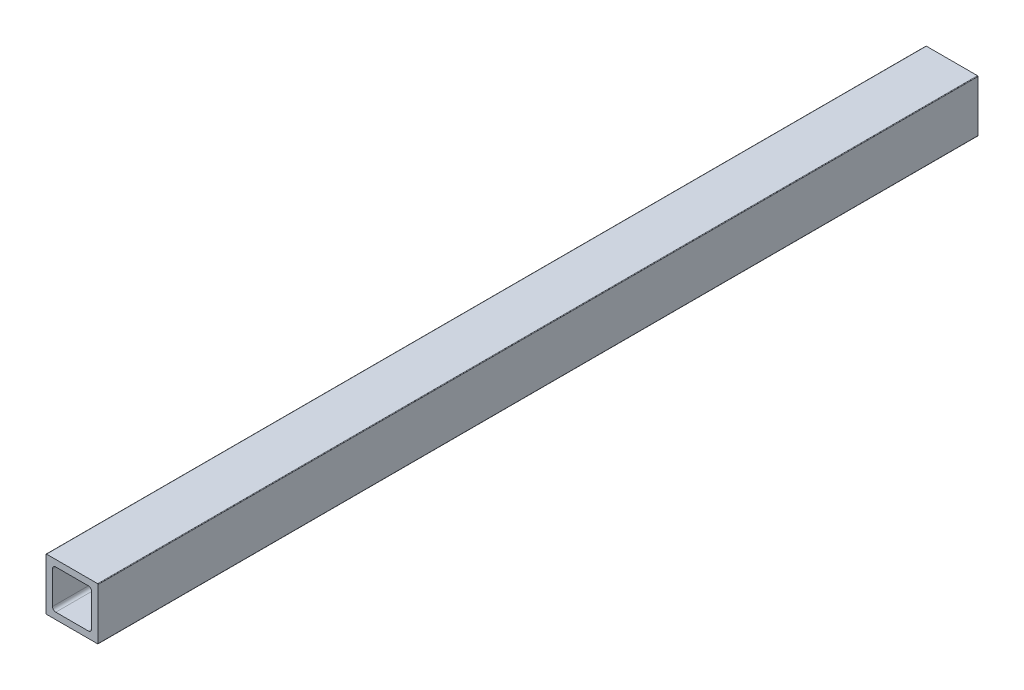
ISO-10303-21;
HEADER;
FILE_DESCRIPTION(('STEP AP214'),'2;1');
FILE_NAME('part.step','',(''),(''),'','','');
FILE_SCHEMA(('AUTOMOTIVE_DESIGN { 1 0 10303 214 1 1 1 1 }'));
ENDSEC;
DATA;
#1=APPLICATION_CONTEXT('core data for automotive mechanical design processes');
#2=APPLICATION_PROTOCOL_DEFINITION('international standard','automotive_design',2000,#1);
#3=PRODUCT_CONTEXT('',#1,'mechanical');
#4=PRODUCT('Part','Part','',(#3));
#5=PRODUCT_RELATED_PRODUCT_CATEGORY('part','',(#4));
#6=PRODUCT_DEFINITION_FORMATION('','',#4);
#7=PRODUCT_DEFINITION_CONTEXT('part definition',#1,'design');
#8=PRODUCT_DEFINITION('design','',#6,#7);
#9=PRODUCT_DEFINITION_SHAPE('','',#8);
#10=(LENGTH_UNIT() NAMED_UNIT(*) SI_UNIT(.MILLI.,.METRE.));
#11=(NAMED_UNIT(*) PLANE_ANGLE_UNIT() SI_UNIT($,.RADIAN.));
#12=(NAMED_UNIT(*) SI_UNIT($,.STERADIAN.) SOLID_ANGLE_UNIT());
#13=UNCERTAINTY_MEASURE_WITH_UNIT(LENGTH_MEASURE(1.E-05),#10,'distance_accuracy_value','');
#14=(GEOMETRIC_REPRESENTATION_CONTEXT(3) GLOBAL_UNCERTAINTY_ASSIGNED_CONTEXT((#13)) GLOBAL_UNIT_ASSIGNED_CONTEXT((#10,
#11,#12)) REPRESENTATION_CONTEXT('',''));
#15=CARTESIAN_POINT('',(0.,0.,0.));
#16=DIRECTION('',(0.,0.,1.));
#17=DIRECTION('',(1.,0.,0.));
#18=AXIS2_PLACEMENT_3D('',#15,#16,#17);
#19=CARTESIAN_POINT('',(0.254,0.254,0.));
#20=DIRECTION('',(0.,0.,-1.));
#21=DIRECTION('',(0.,-1.,0.));
#22=AXIS2_PLACEMENT_3D('',#19,#20,#21);
#23=PLANE('',#22);
#24=CARTESIAN_POINT('',(0.254,0.254,0.));
#25=DIRECTION('',(0.,0.,1.));
#26=DIRECTION('',(-1.,0.,0.));
#27=AXIS2_PLACEMENT_3D('',#24,#25,#26);
#28=CIRCLE('',#27,0.254);
#29=CARTESIAN_POINT('',(0.,0.254,0.));
#30=VERTEX_POINT('',#29);
#31=CARTESIAN_POINT('',(0.254,0.,0.));
#32=VERTEX_POINT('',#31);
#33=EDGE_CURVE('E193',#30,#32,#28,.T.);
#34=ORIENTED_EDGE('',*,*,#33,.F.);
#35=DIRECTION('',(0.,-1.,0.));
#36=VECTOR('',#35,1.);
#37=CARTESIAN_POINT('',(0.,0.254,0.));
#38=LINE('',#37,#36);
#39=CARTESIAN_POINT('',(0.,25.146,0.));
#40=VERTEX_POINT('',#39);
#41=EDGE_CURVE('E191',#40,#30,#38,.T.);
#42=ORIENTED_EDGE('',*,*,#41,.F.);
#43=CARTESIAN_POINT('',(0.254,25.146,0.));
#44=DIRECTION('',(0.,0.,1.));
#45=DIRECTION('',(-1.,0.,0.));
#46=AXIS2_PLACEMENT_3D('',#43,#44,#45);
#47=CIRCLE('',#46,0.254);
#48=CARTESIAN_POINT('',(0.254,25.4,0.));
#49=VERTEX_POINT('',#48);
#50=EDGE_CURVE('E213',#49,#40,#47,.T.);
#51=ORIENTED_EDGE('',*,*,#50,.F.);
#52=DIRECTION('',(-1.,0.,0.));
#53=VECTOR('',#52,1.);
#54=CARTESIAN_POINT('',(0.254,25.4,0.));
#55=LINE('',#54,#53);
#56=CARTESIAN_POINT('',(25.146,25.4,0.));
#57=VERTEX_POINT('',#56);
#58=EDGE_CURVE('E204',#57,#49,#55,.T.);
#59=ORIENTED_EDGE('',*,*,#58,.F.);
#60=CARTESIAN_POINT('',(25.146,25.146,0.));
#61=DIRECTION('',(0.,0.,1.));
#62=DIRECTION('',(-1.,0.,0.));
#63=AXIS2_PLACEMENT_3D('',#60,#61,#62);
#64=CIRCLE('',#63,0.254);
#65=CARTESIAN_POINT('',(25.4,25.146,0.));
#66=VERTEX_POINT('',#65);
#67=EDGE_CURVE('E236',#66,#57,#64,.T.);
#68=ORIENTED_EDGE('',*,*,#67,.F.);
#69=DIRECTION('',(0.,1.,0.));
#70=VECTOR('',#69,1.);
#71=CARTESIAN_POINT('',(25.4,0.254,0.));
#72=LINE('',#71,#70);
#73=CARTESIAN_POINT('',(25.4,0.254,0.));
#74=VERTEX_POINT('',#73);
#75=EDGE_CURVE('E235',#74,#66,#72,.T.);
#76=ORIENTED_EDGE('',*,*,#75,.F.);
#77=CARTESIAN_POINT('',(25.146,0.254,0.));
#78=DIRECTION('',(0.,0.,1.));
#79=DIRECTION('',(1.,0.,0.));
#80=AXIS2_PLACEMENT_3D('',#77,#78,#79);
#81=CIRCLE('',#80,0.254);
#82=CARTESIAN_POINT('',(25.146,0.,0.));
#83=VERTEX_POINT('',#82);
#84=EDGE_CURVE('E206',#83,#74,#81,.T.);
#85=ORIENTED_EDGE('',*,*,#84,.F.);
#86=DIRECTION('',(1.,0.,0.));
#87=VECTOR('',#86,1.);
#88=CARTESIAN_POINT('',(0.254,0.,0.));
#89=LINE('',#88,#87);
#90=EDGE_CURVE('E194',#32,#83,#89,.T.);
#91=ORIENTED_EDGE('',*,*,#90,.F.);
#92=EDGE_LOOP('',(#34,#42,#51,#59,#68,#76,#85,#91));
#93=FACE_BOUND('',#92,.T.);
#94=DIRECTION('',(0.,-1.,0.));
#95=VECTOR('',#94,1.);
#96=CARTESIAN_POINT('',(3.175,4.7625,0.));
#97=LINE('',#96,#95);
#98=CARTESIAN_POINT('',(3.175,20.6375,0.));
#99=VERTEX_POINT('',#98);
#100=CARTESIAN_POINT('',(3.175,4.7625,0.));
#101=VERTEX_POINT('',#100);
#102=EDGE_CURVE('E52',#99,#101,#97,.T.);
#103=ORIENTED_EDGE('',*,*,#102,.T.);
#104=CARTESIAN_POINT('',(4.7625,4.7625,0.));
#105=DIRECTION('',(0.,0.,1.));
#106=DIRECTION('',(1.,0.,0.));
#107=AXIS2_PLACEMENT_3D('',#104,#105,#106);
#108=CIRCLE('',#107,1.5875);
#109=CARTESIAN_POINT('',(4.7625,3.175,0.));
#110=VERTEX_POINT('',#109);
#111=EDGE_CURVE('E266',#101,#110,#108,.T.);
#112=ORIENTED_EDGE('',*,*,#111,.T.);
#113=DIRECTION('',(1.,0.,0.));
#114=VECTOR('',#113,1.);
#115=CARTESIAN_POINT('',(4.7625,3.175,0.));
#116=LINE('',#115,#114);
#117=CARTESIAN_POINT('',(20.6375,3.175,0.));
#118=VERTEX_POINT('',#117);
#119=EDGE_CURVE('E250',#110,#118,#116,.T.);
#120=ORIENTED_EDGE('',*,*,#119,.T.);
#121=CARTESIAN_POINT('',(20.6375,4.7625,0.));
#122=DIRECTION('',(0.,0.,1.));
#123=DIRECTION('',(-1.,0.,0.));
#124=AXIS2_PLACEMENT_3D('',#121,#122,#123);
#125=CIRCLE('',#124,1.5875);
#126=CARTESIAN_POINT('',(22.225,4.7625,0.));
#127=VERTEX_POINT('',#126);
#128=EDGE_CURVE('E223',#118,#127,#125,.T.);
#129=ORIENTED_EDGE('',*,*,#128,.T.);
#130=DIRECTION('',(0.,1.,0.));
#131=VECTOR('',#130,1.);
#132=CARTESIAN_POINT('',(22.225,4.7625,0.));
#133=LINE('',#132,#131);
#134=CARTESIAN_POINT('',(22.225,20.6375,0.));
#135=VERTEX_POINT('',#134);
#136=EDGE_CURVE('E219',#127,#135,#133,.T.);
#137=ORIENTED_EDGE('',*,*,#136,.T.);
#138=CARTESIAN_POINT('',(20.6375,20.6375,0.));
#139=DIRECTION('',(0.,0.,1.));
#140=DIRECTION('',(-1.,0.,0.));
#141=AXIS2_PLACEMENT_3D('',#138,#139,#140);
#142=CIRCLE('',#141,1.5875);
#143=CARTESIAN_POINT('',(20.6375,22.225,0.));
#144=VERTEX_POINT('',#143);
#145=EDGE_CURVE('E224',#135,#144,#142,.T.);
#146=ORIENTED_EDGE('',*,*,#145,.T.);
#147=DIRECTION('',(-1.,0.,0.));
#148=VECTOR('',#147,1.);
#149=CARTESIAN_POINT('',(4.7625,22.225,0.));
#150=LINE('',#149,#148);
#151=CARTESIAN_POINT('',(4.7625,22.225,0.));
#152=VERTEX_POINT('',#151);
#153=EDGE_CURVE('E229',#144,#152,#150,.T.);
#154=ORIENTED_EDGE('',*,*,#153,.T.);
#155=CARTESIAN_POINT('',(4.7625,20.6375,0.));
#156=DIRECTION('',(0.,0.,1.));
#157=DIRECTION('',(-1.,0.,0.));
#158=AXIS2_PLACEMENT_3D('',#155,#156,#157);
#159=CIRCLE('',#158,1.5875);
#160=EDGE_CURVE('E197',#152,#99,#159,.T.);
#161=ORIENTED_EDGE('',*,*,#160,.T.);
#162=EDGE_LOOP('',(#103,#112,#120,#129,#137,#146,#154,#161));
#163=FACE_BOUND('',#162,.T.);
#164=ADVANCED_FACE('F44',(#93,#163),#23,.T.);
#165=CARTESIAN_POINT('',(0.254,0.254,1828.8));
#166=DIRECTION('',(0.,0.,-1.));
#167=DIRECTION('',(-1.,0.,0.));
#168=AXIS2_PLACEMENT_3D('',#165,#166,#167);
#169=CYLINDRICAL_SURFACE('',#168,0.254);
#170=CARTESIAN_POINT('',(0.254,0.254,428.498));
#171=DIRECTION('',(0.,0.,-1.));
#172=DIRECTION('',(-1.,0.,0.));
#173=AXIS2_PLACEMENT_3D('',#170,#171,#172);
#174=CIRCLE('',#173,0.254);
#175=CARTESIAN_POINT('',(0.,0.254,428.498));
#176=VERTEX_POINT('',#175);
#177=CARTESIAN_POINT('',(0.254,0.,428.498));
#178=VERTEX_POINT('',#177);
#179=EDGE_CURVE('E172',#176,#178,#174,.F.);
#180=ORIENTED_EDGE('',*,*,#179,.F.);
#181=DIRECTION('',(0.,0.,-1.));
#182=VECTOR('',#181,1.);
#183=CARTESIAN_POINT('',(0.,0.254,1828.8));
#184=LINE('',#183,#182);
#185=EDGE_CURVE('E183',#176,#30,#184,.T.);
#186=ORIENTED_EDGE('',*,*,#185,.T.);
#187=ORIENTED_EDGE('',*,*,#33,.T.);
#188=DIRECTION('',(0.,0.,-1.));
#189=VECTOR('',#188,1.);
#190=CARTESIAN_POINT('',(0.254,0.,1828.8));
#191=LINE('',#190,#189);
#192=EDGE_CURVE('E185',#178,#32,#191,.T.);
#193=ORIENTED_EDGE('',*,*,#192,.F.);
#194=EDGE_LOOP('',(#180,#186,#187,#193));
#195=FACE_BOUND('',#194,.T.);
#196=ADVANCED_FACE('F181',(#195),#169,.T.);
#197=CARTESIAN_POINT('',(0.254,0.,1828.8));
#198=DIRECTION('',(0.,1.,0.));
#199=DIRECTION('',(1.,0.,0.));
#200=AXIS2_PLACEMENT_3D('',#197,#198,#199);
#201=PLANE('',#200);
#202=DIRECTION('',(0.,0.,-1.));
#203=VECTOR('',#202,1.);
#204=CARTESIAN_POINT('',(25.146,0.,1828.8));
#205=LINE('',#204,#203);
#206=CARTESIAN_POINT('',(25.146,0.,428.498));
#207=VERTEX_POINT('',#206);
#208=EDGE_CURVE('E210',#207,#83,#205,.T.);
#209=ORIENTED_EDGE('',*,*,#208,.F.);
#210=DIRECTION('',(1.,0.,0.));
#211=VECTOR('',#210,1.);
#212=CARTESIAN_POINT('',(0.,0.,428.498));
#213=LINE('',#212,#211);
#214=EDGE_CURVE('E177',#178,#207,#213,.T.);
#215=ORIENTED_EDGE('',*,*,#214,.F.);
#216=ORIENTED_EDGE('',*,*,#192,.T.);
#217=ORIENTED_EDGE('',*,*,#90,.T.);
#218=EDGE_LOOP('',(#209,#215,#216,#217));
#219=FACE_BOUND('',#218,.T.);
#220=ADVANCED_FACE('F289',(#219),#201,.F.);
#221=CARTESIAN_POINT('',(25.146,0.254,1828.8));
#222=DIRECTION('',(0.,0.,-1.));
#223=DIRECTION('',(-1.,0.,0.));
#224=AXIS2_PLACEMENT_3D('',#221,#222,#223);
#225=CYLINDRICAL_SURFACE('',#224,0.254);
#226=CARTESIAN_POINT('',(25.146,0.254,428.498));
#227=DIRECTION('',(0.,0.,-1.));
#228=DIRECTION('',(-1.,0.,0.));
#229=AXIS2_PLACEMENT_3D('',#226,#227,#228);
#230=CIRCLE('',#229,0.254);
#231=CARTESIAN_POINT('',(25.4,0.254,428.498));
#232=VERTEX_POINT('',#231);
#233=EDGE_CURVE('E187',#207,#232,#230,.F.);
#234=ORIENTED_EDGE('',*,*,#233,.F.);
#235=ORIENTED_EDGE('',*,*,#208,.T.);
#236=ORIENTED_EDGE('',*,*,#84,.T.);
#237=DIRECTION('',(0.,0.,-1.));
#238=VECTOR('',#237,1.);
#239=CARTESIAN_POINT('',(25.4,0.254,1828.8));
#240=LINE('',#239,#238);
#241=EDGE_CURVE('E233',#232,#74,#240,.T.);
#242=ORIENTED_EDGE('',*,*,#241,.F.);
#243=EDGE_LOOP('',(#234,#235,#236,#242));
#244=FACE_BOUND('',#243,.T.);
#245=ADVANCED_FACE('F283',(#244),#225,.T.);
#246=CARTESIAN_POINT('',(25.4,0.254,1828.8));
#247=DIRECTION('',(-1.,0.,0.));
#248=DIRECTION('',(0.,0.,1.));
#249=AXIS2_PLACEMENT_3D('',#246,#247,#248);
#250=PLANE('',#249);
#251=DIRECTION('',(0.,0.,-1.));
#252=VECTOR('',#251,1.);
#253=CARTESIAN_POINT('',(25.4,25.146,1828.8));
#254=LINE('',#253,#252);
#255=CARTESIAN_POINT('',(25.4,25.146,428.498));
#256=VERTEX_POINT('',#255);
#257=EDGE_CURVE('E258',#256,#66,#254,.T.);
#258=ORIENTED_EDGE('',*,*,#257,.F.);
#259=DIRECTION('',(0.,1.,0.));
#260=VECTOR('',#259,1.);
#261=CARTESIAN_POINT('',(25.4,0.,428.498));
#262=LINE('',#261,#260);
#263=EDGE_CURVE('E498',#232,#256,#262,.T.);
#264=ORIENTED_EDGE('',*,*,#263,.F.);
#265=ORIENTED_EDGE('',*,*,#241,.T.);
#266=ORIENTED_EDGE('',*,*,#75,.T.);
#267=EDGE_LOOP('',(#258,#264,#265,#266));
#268=FACE_BOUND('',#267,.T.);
#269=ADVANCED_FACE('F288',(#268),#250,.F.);
#270=CARTESIAN_POINT('',(25.146,25.146,1828.8));
#271=DIRECTION('',(0.,0.,-1.));
#272=DIRECTION('',(-1.,0.,0.));
#273=AXIS2_PLACEMENT_3D('',#270,#271,#272);
#274=CYLINDRICAL_SURFACE('',#273,0.254);
#275=CARTESIAN_POINT('',(25.146,25.146,428.498));
#276=DIRECTION('',(0.,0.,-1.));
#277=DIRECTION('',(-1.,0.,0.));
#278=AXIS2_PLACEMENT_3D('',#275,#276,#277);
#279=CIRCLE('',#278,0.254);
#280=CARTESIAN_POINT('',(25.146,25.4,428.498));
#281=VERTEX_POINT('',#280);
#282=EDGE_CURVE('E492',#256,#281,#279,.F.);
#283=ORIENTED_EDGE('',*,*,#282,.F.);
#284=ORIENTED_EDGE('',*,*,#257,.T.);
#285=ORIENTED_EDGE('',*,*,#67,.T.);
#286=DIRECTION('',(0.,0.,-1.));
#287=VECTOR('',#286,1.);
#288=CARTESIAN_POINT('',(25.146,25.4,1828.8));
#289=LINE('',#288,#287);
#290=EDGE_CURVE('E227',#281,#57,#289,.T.);
#291=ORIENTED_EDGE('',*,*,#290,.F.);
#292=EDGE_LOOP('',(#283,#284,#285,#291));
#293=FACE_BOUND('',#292,.T.);
#294=ADVANCED_FACE('F46',(#293),#274,.T.);
#295=CARTESIAN_POINT('',(0.254,25.4,1828.8));
#296=DIRECTION('',(0.,-1.,0.));
#297=DIRECTION('',(0.,0.,-1.));
#298=AXIS2_PLACEMENT_3D('',#295,#296,#297);
#299=PLANE('',#298);
#300=DIRECTION('',(0.,0.,-1.));
#301=VECTOR('',#300,1.);
#302=CARTESIAN_POINT('',(0.254,25.4,1828.8));
#303=LINE('',#302,#301);
#304=CARTESIAN_POINT('',(0.254,25.4,428.498));
#305=VERTEX_POINT('',#304);
#306=EDGE_CURVE('E211',#305,#49,#303,.T.);
#307=ORIENTED_EDGE('',*,*,#306,.F.);
#308=DIRECTION('',(-1.,0.,0.));
#309=VECTOR('',#308,1.);
#310=CARTESIAN_POINT('',(0.,25.4,428.498));
#311=LINE('',#310,#309);
#312=EDGE_CURVE('E545',#281,#305,#311,.T.);
#313=ORIENTED_EDGE('',*,*,#312,.F.);
#314=ORIENTED_EDGE('',*,*,#290,.T.);
#315=ORIENTED_EDGE('',*,*,#58,.T.);
#316=EDGE_LOOP('',(#307,#313,#314,#315));
#317=FACE_BOUND('',#316,.T.);
#318=ADVANCED_FACE('F347',(#317),#299,.F.);
#319=CARTESIAN_POINT('',(0.254,25.146,1828.8));
#320=DIRECTION('',(0.,0.,-1.));
#321=DIRECTION('',(-1.,0.,0.));
#322=AXIS2_PLACEMENT_3D('',#319,#320,#321);
#323=CYLINDRICAL_SURFACE('',#322,0.254);
#324=CARTESIAN_POINT('',(0.254,25.146,428.498));
#325=DIRECTION('',(0.,0.,-1.));
#326=DIRECTION('',(-1.,0.,0.));
#327=AXIS2_PLACEMENT_3D('',#324,#325,#326);
#328=CIRCLE('',#327,0.254);
#329=CARTESIAN_POINT('',(0.,25.146,428.498));
#330=VERTEX_POINT('',#329);
#331=EDGE_CURVE('E59',#305,#330,#328,.F.);
#332=ORIENTED_EDGE('',*,*,#331,.F.);
#333=ORIENTED_EDGE('',*,*,#306,.T.);
#334=ORIENTED_EDGE('',*,*,#50,.T.);
#335=DIRECTION('',(0.,0.,-1.));
#336=VECTOR('',#335,1.);
#337=CARTESIAN_POINT('',(0.,25.146,1828.8));
#338=LINE('',#337,#336);
#339=EDGE_CURVE('E216',#330,#40,#338,.T.);
#340=ORIENTED_EDGE('',*,*,#339,.F.);
#341=EDGE_LOOP('',(#332,#333,#334,#340));
#342=FACE_BOUND('',#341,.T.);
#343=ADVANCED_FACE('F276',(#342),#323,.T.);
#344=CARTESIAN_POINT('',(0.,0.254,1828.8));
#345=DIRECTION('',(1.,0.,0.));
#346=DIRECTION('',(0.,1.,0.));
#347=AXIS2_PLACEMENT_3D('',#344,#345,#346);
#348=PLANE('',#347);
#349=ORIENTED_EDGE('',*,*,#185,.F.);
#350=DIRECTION('',(0.,-1.,0.));
#351=VECTOR('',#350,1.);
#352=CARTESIAN_POINT('',(0.,0.,428.498));
#353=LINE('',#352,#351);
#354=EDGE_CURVE('E169',#330,#176,#353,.T.);
#355=ORIENTED_EDGE('',*,*,#354,.F.);
#356=ORIENTED_EDGE('',*,*,#339,.T.);
#357=ORIENTED_EDGE('',*,*,#41,.T.);
#358=EDGE_LOOP('',(#349,#355,#356,#357));
#359=FACE_BOUND('',#358,.T.);
#360=ADVANCED_FACE('F189',(#359),#348,.F.);
#361=CARTESIAN_POINT('',(4.7625,4.7625,1828.8));
#362=DIRECTION('',(0.,0.,-1.));
#363=DIRECTION('',(-1.,0.,0.));
#364=AXIS2_PLACEMENT_3D('',#361,#362,#363);
#365=CYLINDRICAL_SURFACE('',#364,1.5875);
#366=DIRECTION('',(0.,0.,-1.));
#367=VECTOR('',#366,1.);
#368=CARTESIAN_POINT('',(3.175,4.7625,1828.8));
#369=LINE('',#368,#367);
#370=CARTESIAN_POINT('',(3.175,4.7625,428.498));
#371=VERTEX_POINT('',#370);
#372=EDGE_CURVE('E186',#371,#101,#369,.T.);
#373=ORIENTED_EDGE('',*,*,#372,.F.);
#374=CARTESIAN_POINT('',(4.7625,4.7625,428.498));
#375=DIRECTION('',(0.,0.,-1.));
#376=DIRECTION('',(-1.,0.,0.));
#377=AXIS2_PLACEMENT_3D('',#374,#375,#376);
#378=CIRCLE('',#377,1.5875);
#379=CARTESIAN_POINT('',(4.7625,3.175,428.498));
#380=VERTEX_POINT('',#379);
#381=EDGE_CURVE('E66',#371,#380,#378,.F.);
#382=ORIENTED_EDGE('',*,*,#381,.T.);
#383=DIRECTION('',(0.,0.,-1.));
#384=VECTOR('',#383,1.);
#385=CARTESIAN_POINT('',(4.7625,3.175,1828.8));
#386=LINE('',#385,#384);
#387=EDGE_CURVE('E214',#380,#110,#386,.T.);
#388=ORIENTED_EDGE('',*,*,#387,.T.);
#389=ORIENTED_EDGE('',*,*,#111,.F.);
#390=EDGE_LOOP('',(#373,#382,#388,#389));
#391=FACE_BOUND('',#390,.T.);
#392=ADVANCED_FACE('F275',(#391),#365,.F.);
#393=CARTESIAN_POINT('',(4.7625,3.175,1828.8));
#394=DIRECTION('',(0.,1.,0.));
#395=DIRECTION('',(1.,0.,0.));
#396=AXIS2_PLACEMENT_3D('',#393,#394,#395);
#397=PLANE('',#396);
#398=DIRECTION('',(-1.,0.,0.));
#399=VECTOR('',#398,1.);
#400=CARTESIAN_POINT('',(4.7625,3.175,428.498));
#401=LINE('',#400,#399);
#402=CARTESIAN_POINT('',(20.6375,3.175,428.498));
#403=VERTEX_POINT('',#402);
#404=EDGE_CURVE('E532',#403,#380,#401,.T.);
#405=ORIENTED_EDGE('',*,*,#404,.F.);
#406=DIRECTION('',(0.,0.,-1.));
#407=VECTOR('',#406,1.);
#408=CARTESIAN_POINT('',(20.6375,3.175,1828.8));
#409=LINE('',#408,#407);
#410=EDGE_CURVE('E217',#403,#118,#409,.T.);
#411=ORIENTED_EDGE('',*,*,#410,.T.);
#412=ORIENTED_EDGE('',*,*,#119,.F.);
#413=ORIENTED_EDGE('',*,*,#387,.F.);
#414=EDGE_LOOP('',(#405,#411,#412,#413));
#415=FACE_BOUND('',#414,.T.);
#416=ADVANCED_FACE('F302',(#415),#397,.T.);
#417=CARTESIAN_POINT('',(20.6375,4.7625,1828.8));
#418=DIRECTION('',(0.,0.,-1.));
#419=DIRECTION('',(-1.,0.,0.));
#420=AXIS2_PLACEMENT_3D('',#417,#418,#419);
#421=CYLINDRICAL_SURFACE('',#420,1.5875);
#422=ORIENTED_EDGE('',*,*,#410,.F.);
#423=CARTESIAN_POINT('',(20.6375,4.7625,428.498));
#424=DIRECTION('',(0.,0.,-1.));
#425=DIRECTION('',(-1.,0.,0.));
#426=AXIS2_PLACEMENT_3D('',#423,#424,#425);
#427=CIRCLE('',#426,1.5875);
#428=CARTESIAN_POINT('',(22.225,4.7625,428.498));
#429=VERTEX_POINT('',#428);
#430=EDGE_CURVE('E513',#403,#429,#427,.F.);
#431=ORIENTED_EDGE('',*,*,#430,.T.);
#432=DIRECTION('',(0.,0.,-1.));
#433=VECTOR('',#432,1.);
#434=CARTESIAN_POINT('',(22.225,4.7625,1828.8));
#435=LINE('',#434,#433);
#436=EDGE_CURVE('E254',#429,#127,#435,.T.);
#437=ORIENTED_EDGE('',*,*,#436,.T.);
#438=ORIENTED_EDGE('',*,*,#128,.F.);
#439=EDGE_LOOP('',(#422,#431,#437,#438));
#440=FACE_BOUND('',#439,.T.);
#441=ADVANCED_FACE('F297',(#440),#421,.F.);
#442=CARTESIAN_POINT('',(22.225,4.7625,1828.8));
#443=DIRECTION('',(-1.,0.,0.));
#444=DIRECTION('',(0.,0.,1.));
#445=AXIS2_PLACEMENT_3D('',#442,#443,#444);
#446=PLANE('',#445);
#447=DIRECTION('',(0.,-1.,0.));
#448=VECTOR('',#447,1.);
#449=CARTESIAN_POINT('',(22.225,4.7625,428.498));
#450=LINE('',#449,#448);
#451=CARTESIAN_POINT('',(22.225,20.6375,428.498));
#452=VERTEX_POINT('',#451);
#453=EDGE_CURVE('E535',#452,#429,#450,.T.);
#454=ORIENTED_EDGE('',*,*,#453,.F.);
#455=DIRECTION('',(0.,0.,-1.));
#456=VECTOR('',#455,1.);
#457=CARTESIAN_POINT('',(22.225,20.6375,1828.8));
#458=LINE('',#457,#456);
#459=EDGE_CURVE('E240',#452,#135,#458,.T.);
#460=ORIENTED_EDGE('',*,*,#459,.T.);
#461=ORIENTED_EDGE('',*,*,#136,.F.);
#462=ORIENTED_EDGE('',*,*,#436,.F.);
#463=EDGE_LOOP('',(#454,#460,#461,#462));
#464=FACE_BOUND('',#463,.T.);
#465=ADVANCED_FACE('F301',(#464),#446,.T.);
#466=CARTESIAN_POINT('',(20.6375,20.6375,1828.8));
#467=DIRECTION('',(0.,0.,-1.));
#468=DIRECTION('',(-1.,0.,0.));
#469=AXIS2_PLACEMENT_3D('',#466,#467,#468);
#470=CYLINDRICAL_SURFACE('',#469,1.5875);
#471=ORIENTED_EDGE('',*,*,#459,.F.);
#472=CARTESIAN_POINT('',(20.6375,20.6375,428.498));
#473=DIRECTION('',(0.,0.,-1.));
#474=DIRECTION('',(-1.,0.,0.));
#475=AXIS2_PLACEMENT_3D('',#472,#473,#474);
#476=CIRCLE('',#475,1.5875);
#477=CARTESIAN_POINT('',(20.6375,22.225,428.498));
#478=VERTEX_POINT('',#477);
#479=EDGE_CURVE('E537',#452,#478,#476,.F.);
#480=ORIENTED_EDGE('',*,*,#479,.T.);
#481=DIRECTION('',(0.,0.,-1.));
#482=VECTOR('',#481,1.);
#483=CARTESIAN_POINT('',(20.6375,22.225,1828.8));
#484=LINE('',#483,#482);
#485=EDGE_CURVE('E238',#478,#144,#484,.T.);
#486=ORIENTED_EDGE('',*,*,#485,.T.);
#487=ORIENTED_EDGE('',*,*,#145,.F.);
#488=EDGE_LOOP('',(#471,#480,#486,#487));
#489=FACE_BOUND('',#488,.T.);
#490=ADVANCED_FACE('F309',(#489),#470,.F.);
#491=CARTESIAN_POINT('',(4.7625,22.225,1828.8));
#492=DIRECTION('',(0.,-1.,0.));
#493=DIRECTION('',(0.,0.,-1.));
#494=AXIS2_PLACEMENT_3D('',#491,#492,#493);
#495=PLANE('',#494);
#496=DIRECTION('',(1.,0.,0.));
#497=VECTOR('',#496,1.);
#498=CARTESIAN_POINT('',(4.7625,22.225,428.498));
#499=LINE('',#498,#497);
#500=CARTESIAN_POINT('',(4.7625,22.225,428.498));
#501=VERTEX_POINT('',#500);
#502=EDGE_CURVE('E540',#501,#478,#499,.T.);
#503=ORIENTED_EDGE('',*,*,#502,.F.);
#504=DIRECTION('',(0.,0.,-1.));
#505=VECTOR('',#504,1.);
#506=CARTESIAN_POINT('',(4.7625,22.225,1828.8));
#507=LINE('',#506,#505);
#508=EDGE_CURVE('E241',#501,#152,#507,.T.);
#509=ORIENTED_EDGE('',*,*,#508,.T.);
#510=ORIENTED_EDGE('',*,*,#153,.F.);
#511=ORIENTED_EDGE('',*,*,#485,.F.);
#512=EDGE_LOOP('',(#503,#509,#510,#511));
#513=FACE_BOUND('',#512,.T.);
#514=ADVANCED_FACE('F313',(#513),#495,.T.);
#515=CARTESIAN_POINT('',(4.7625,20.6375,1828.8));
#516=DIRECTION('',(0.,0.,-1.));
#517=DIRECTION('',(-1.,0.,0.));
#518=AXIS2_PLACEMENT_3D('',#515,#516,#517);
#519=CYLINDRICAL_SURFACE('',#518,1.5875);
#520=ORIENTED_EDGE('',*,*,#508,.F.);
#521=CARTESIAN_POINT('',(4.7625,20.6375,428.498));
#522=DIRECTION('',(0.,0.,-1.));
#523=DIRECTION('',(-1.,0.,0.));
#524=AXIS2_PLACEMENT_3D('',#521,#522,#523);
#525=CIRCLE('',#524,1.5875);
#526=CARTESIAN_POINT('',(3.175,20.6375,428.498));
#527=VERTEX_POINT('',#526);
#528=EDGE_CURVE('E542',#501,#527,#525,.F.);
#529=ORIENTED_EDGE('',*,*,#528,.T.);
#530=DIRECTION('',(0.,0.,-1.));
#531=VECTOR('',#530,1.);
#532=CARTESIAN_POINT('',(3.175,20.6375,1828.8));
#533=LINE('',#532,#531);
#534=EDGE_CURVE('E245',#527,#99,#533,.T.);
#535=ORIENTED_EDGE('',*,*,#534,.T.);
#536=ORIENTED_EDGE('',*,*,#160,.F.);
#537=EDGE_LOOP('',(#520,#529,#535,#536));
#538=FACE_BOUND('',#537,.T.);
#539=ADVANCED_FACE('F390',(#538),#519,.F.);
#540=CARTESIAN_POINT('',(3.175,4.7625,1828.8));
#541=DIRECTION('',(1.,0.,0.));
#542=DIRECTION('',(0.,1.,0.));
#543=AXIS2_PLACEMENT_3D('',#540,#541,#542);
#544=PLANE('',#543);
#545=DIRECTION('',(0.,1.,0.));
#546=VECTOR('',#545,1.);
#547=CARTESIAN_POINT('',(3.175,4.7625,428.498));
#548=LINE('',#547,#546);
#549=EDGE_CURVE('E11',#371,#527,#548,.T.);
#550=ORIENTED_EDGE('',*,*,#549,.F.);
#551=ORIENTED_EDGE('',*,*,#372,.T.);
#552=ORIENTED_EDGE('',*,*,#102,.F.);
#553=ORIENTED_EDGE('',*,*,#534,.F.);
#554=EDGE_LOOP('',(#550,#551,#552,#553));
#555=FACE_BOUND('',#554,.T.);
#556=ADVANCED_FACE('F394',(#555),#544,.T.);
#557=CARTESIAN_POINT('',(0.,0.,428.498));
#558=DIRECTION('',(0.,0.,-1.));
#559=DIRECTION('',(-1.,0.,0.));
#560=AXIS2_PLACEMENT_3D('',#557,#558,#559);
#561=PLANE('',#560);
#562=ORIENTED_EDGE('',*,*,#179,.T.);
#563=ORIENTED_EDGE('',*,*,#214,.T.);
#564=ORIENTED_EDGE('',*,*,#233,.T.);
#565=ORIENTED_EDGE('',*,*,#263,.T.);
#566=ORIENTED_EDGE('',*,*,#282,.T.);
#567=ORIENTED_EDGE('',*,*,#312,.T.);
#568=ORIENTED_EDGE('',*,*,#331,.T.);
#569=ORIENTED_EDGE('',*,*,#354,.T.);
#570=EDGE_LOOP('',(#562,#563,#564,#565,#566,#567,#568,#569));
#571=FACE_BOUND('',#570,.T.);
#572=ORIENTED_EDGE('',*,*,#549,.T.);
#573=ORIENTED_EDGE('',*,*,#528,.F.);
#574=ORIENTED_EDGE('',*,*,#502,.T.);
#575=ORIENTED_EDGE('',*,*,#479,.F.);
#576=ORIENTED_EDGE('',*,*,#453,.T.);
#577=ORIENTED_EDGE('',*,*,#430,.F.);
#578=ORIENTED_EDGE('',*,*,#404,.T.);
#579=ORIENTED_EDGE('',*,*,#381,.F.);
#580=EDGE_LOOP('',(#572,#573,#574,#575,#576,#577,#578,#579));
#581=FACE_BOUND('',#580,.T.);
#582=ADVANCED_FACE('F171',(#571,#581),#561,.F.);
#583=CLOSED_SHELL('',(#164,#196,#220,#245,#269,#294,#318,#343,#360,#392,#416,#441,#465,#490,
#514,#539,#556,#582));
#584=MANIFOLD_SOLID_BREP('B2',#583);
#585=ADVANCED_BREP_SHAPE_REPRESENTATION('',(#18,#584),#14);
#586=SHAPE_DEFINITION_REPRESENTATION(#9,#585);
ENDSEC;
END-ISO-10303-21;
